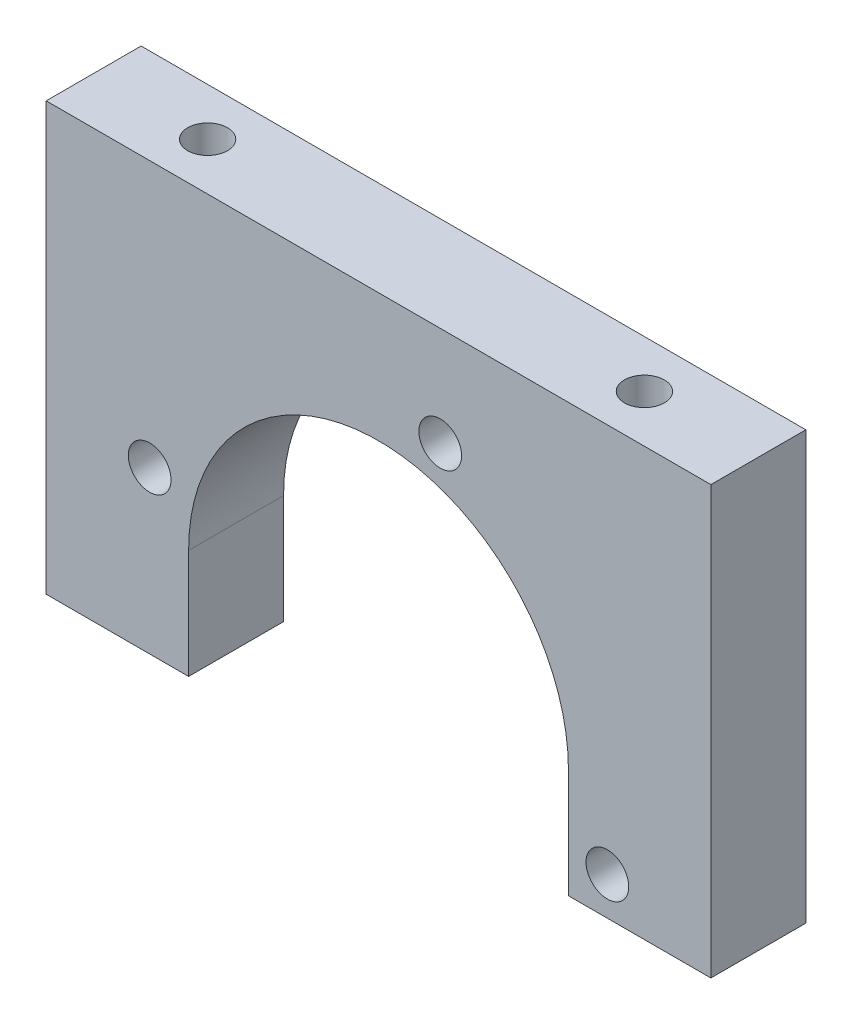
ISO-10303-21;
HEADER;
FILE_DESCRIPTION(('STEP AP214'),'2;1');
FILE_NAME('part.step','',(''),(''),'','','');
FILE_SCHEMA(('AUTOMOTIVE_DESIGN { 1 0 10303 214 1 1 1 1 }'));
ENDSEC;
DATA;
#1=APPLICATION_CONTEXT('core data for automotive mechanical design processes');
#2=APPLICATION_PROTOCOL_DEFINITION('international standard','automotive_design',2000,#1);
#3=PRODUCT_CONTEXT('',#1,'mechanical');
#4=PRODUCT('Part','Part','',(#3));
#5=PRODUCT_RELATED_PRODUCT_CATEGORY('part','',(#4));
#6=PRODUCT_DEFINITION_FORMATION('','',#4);
#7=PRODUCT_DEFINITION_CONTEXT('part definition',#1,'design');
#8=PRODUCT_DEFINITION('design','',#6,#7);
#9=PRODUCT_DEFINITION_SHAPE('','',#8);
#10=(LENGTH_UNIT() NAMED_UNIT(*) SI_UNIT(.MILLI.,.METRE.));
#11=(NAMED_UNIT(*) PLANE_ANGLE_UNIT() SI_UNIT($,.RADIAN.));
#12=(NAMED_UNIT(*) SI_UNIT($,.STERADIAN.) SOLID_ANGLE_UNIT());
#13=UNCERTAINTY_MEASURE_WITH_UNIT(LENGTH_MEASURE(1.E-05),#10,'distance_accuracy_value','');
#14=(GEOMETRIC_REPRESENTATION_CONTEXT(3) GLOBAL_UNCERTAINTY_ASSIGNED_CONTEXT((#13)) GLOBAL_UNIT_ASSIGNED_CONTEXT((#10,
#11,#12)) REPRESENTATION_CONTEXT('',''));
#15=CARTESIAN_POINT('',(0.,0.,0.));
#16=DIRECTION('',(0.,0.,1.));
#17=DIRECTION('',(1.,0.,0.));
#18=AXIS2_PLACEMENT_3D('',#15,#16,#17);
#19=CARTESIAN_POINT('',(-23.,16.5000000000077,5.));
#20=DIRECTION('',(0.,1.,0.));
#21=DIRECTION('',(0.,0.,1.));
#22=AXIS2_PLACEMENT_3D('',#19,#20,#21);
#23=CONICAL_SURFACE('',#22,2.0999999999799,1.02974425868254);
#24=CARTESIAN_POINT('',(-23.,15.2381927001102,5.));
#25=VERTEX_POINT('',#24);
#26=VERTEX_LOOP('',#25);
#27=FACE_BOUND('',#26,.T.);
#28=CARTESIAN_POINT('',(-23.,16.5,5.));
#29=DIRECTION('',(0.,1.,0.));
#30=DIRECTION('',(0.,0.,1.));
#31=AXIS2_PLACEMENT_3D('',#28,#29,#30);
#32=CIRCLE('',#31,2.1);
#33=CARTESIAN_POINT('',(-23.,16.5,7.1));
#34=VERTEX_POINT('',#33);
#35=EDGE_CURVE('E101',#34,#34,#32,.T.);
#36=ORIENTED_EDGE('',*,*,#35,.T.);
#37=EDGE_LOOP('',(#36));
#38=FACE_BOUND('',#37,.T.);
#39=ADVANCED_FACE('F16',(#27,#38),#23,.F.);
#40=CARTESIAN_POINT('',(23.,16.5000000000077,5.));
#41=DIRECTION('',(0.,1.,0.));
#42=DIRECTION('',(0.,0.,1.));
#43=AXIS2_PLACEMENT_3D('',#40,#41,#42);
#44=CONICAL_SURFACE('',#43,2.0999999999799,1.02974425868254);
#45=CARTESIAN_POINT('',(23.,15.2381927001102,5.));
#46=VERTEX_POINT('',#45);
#47=VERTEX_LOOP('',#46);
#48=FACE_BOUND('',#47,.T.);
#49=CARTESIAN_POINT('',(23.,16.5,5.));
#50=DIRECTION('',(0.,1.,0.));
#51=DIRECTION('',(0.,0.,1.));
#52=AXIS2_PLACEMENT_3D('',#49,#50,#51);
#53=CIRCLE('',#52,2.1);
#54=CARTESIAN_POINT('',(23.,16.5,7.1));
#55=VERTEX_POINT('',#54);
#56=EDGE_CURVE('E103',#55,#55,#53,.T.);
#57=ORIENTED_EDGE('',*,*,#56,.T.);
#58=EDGE_LOOP('',(#57));
#59=FACE_BOUND('',#58,.T.);
#60=ADVANCED_FACE('F98',(#48,#59),#44,.F.);
#61=CARTESIAN_POINT('',(-23.,33.5,5.));
#62=DIRECTION('',(0.,1.,0.));
#63=DIRECTION('',(0.,0.,1.));
#64=AXIS2_PLACEMENT_3D('',#61,#62,#63);
#65=CYLINDRICAL_SURFACE('',#64,2.1);
#66=ORIENTED_EDGE('',*,*,#35,.F.);
#67=EDGE_LOOP('',(#66));
#68=FACE_BOUND('',#67,.T.);
#69=CARTESIAN_POINT('',(-23.,33.5,5.));
#70=DIRECTION('',(0.,1.,0.));
#71=DIRECTION('',(0.,0.,1.));
#72=AXIS2_PLACEMENT_3D('',#69,#70,#71);
#73=CIRCLE('',#72,2.1);
#74=CARTESIAN_POINT('',(-23.,33.5,7.1));
#75=VERTEX_POINT('',#74);
#76=EDGE_CURVE('E126',#75,#75,#73,.T.);
#77=ORIENTED_EDGE('',*,*,#76,.T.);
#78=EDGE_LOOP('',(#77));
#79=FACE_BOUND('',#78,.T.);
#80=ADVANCED_FACE('F293',(#68,#79),#65,.F.);
#81=CARTESIAN_POINT('',(23.,33.5,5.));
#82=DIRECTION('',(0.,1.,0.));
#83=DIRECTION('',(0.,0.,1.));
#84=AXIS2_PLACEMENT_3D('',#81,#82,#83);
#85=CYLINDRICAL_SURFACE('',#84,2.1);
#86=ORIENTED_EDGE('',*,*,#56,.F.);
#87=EDGE_LOOP('',(#86));
#88=FACE_BOUND('',#87,.T.);
#89=CARTESIAN_POINT('',(23.,33.5,5.));
#90=DIRECTION('',(0.,1.,0.));
#91=DIRECTION('',(0.,0.,1.));
#92=AXIS2_PLACEMENT_3D('',#89,#90,#91);
#93=CIRCLE('',#92,2.1);
#94=CARTESIAN_POINT('',(23.,33.5,7.1));
#95=VERTEX_POINT('',#94);
#96=EDGE_CURVE('E122',#95,#95,#93,.T.);
#97=ORIENTED_EDGE('',*,*,#96,.T.);
#98=EDGE_LOOP('',(#97));
#99=FACE_BOUND('',#98,.T.);
#100=ADVANCED_FACE('F154',(#88,#99),#85,.F.);
#101=CARTESIAN_POINT('',(-35.,-11.5,0.));
#102=DIRECTION('',(0.,0.,1.));
#103=DIRECTION('',(1.,0.,0.));
#104=AXIS2_PLACEMENT_3D('',#101,#102,#103);
#105=PLANE('',#104);
#106=DIRECTION('',(0.,1.,0.));
#107=VECTOR('',#106,1.);
#108=CARTESIAN_POINT('',(20.,-11.5,0.));
#109=LINE('',#108,#107);
#110=CARTESIAN_POINT('',(20.,-11.5,0.));
#111=VERTEX_POINT('',#110);
#112=CARTESIAN_POINT('',(20.,0.,0.));
#113=VERTEX_POINT('',#112);
#114=EDGE_CURVE('E52',#111,#113,#109,.T.);
#115=ORIENTED_EDGE('',*,*,#114,.T.);
#116=CARTESIAN_POINT('',(0.,0.,0.));
#117=DIRECTION('',(0.,0.,-1.));
#118=DIRECTION('',(-1.,0.,0.));
#119=AXIS2_PLACEMENT_3D('',#116,#117,#118);
#120=CIRCLE('',#119,20.);
#121=CARTESIAN_POINT('',(-20.,0.,0.));
#122=VERTEX_POINT('',#121);
#123=EDGE_CURVE('E119',#113,#122,#120,.F.);
#124=ORIENTED_EDGE('',*,*,#123,.T.);
#125=DIRECTION('',(0.,-1.,0.));
#126=VECTOR('',#125,1.);
#127=CARTESIAN_POINT('',(-20.,-11.5,0.));
#128=LINE('',#127,#126);
#129=CARTESIAN_POINT('',(-20.,-11.5,0.));
#130=VERTEX_POINT('',#129);
#131=EDGE_CURVE('E57',#122,#130,#128,.T.);
#132=ORIENTED_EDGE('',*,*,#131,.T.);
#133=DIRECTION('',(1.,0.,0.));
#134=VECTOR('',#133,1.);
#135=CARTESIAN_POINT('',(-35.,-11.5,0.));
#136=LINE('',#135,#134);
#137=CARTESIAN_POINT('',(-35.,-11.5,0.));
#138=VERTEX_POINT('',#137);
#139=EDGE_CURVE('E64',#130,#138,#136,.F.);
#140=ORIENTED_EDGE('',*,*,#139,.T.);
#141=DIRECTION('',(0.,1.,0.));
#142=VECTOR('',#141,1.);
#143=CARTESIAN_POINT('',(-35.,33.5,0.));
#144=LINE('',#143,#142);
#145=CARTESIAN_POINT('',(-35.,33.5,0.));
#146=VERTEX_POINT('',#145);
#147=EDGE_CURVE('E399',#138,#146,#144,.T.);
#148=ORIENTED_EDGE('',*,*,#147,.T.);
#149=DIRECTION('',(1.,0.,0.));
#150=VECTOR('',#149,1.);
#151=CARTESIAN_POINT('',(-35.,33.5,0.));
#152=LINE('',#151,#150);
#153=CARTESIAN_POINT('',(35.,33.5,0.));
#154=VERTEX_POINT('',#153);
#155=EDGE_CURVE('E409',#146,#154,#152,.T.);
#156=ORIENTED_EDGE('',*,*,#155,.T.);
#157=DIRECTION('',(0.,1.,0.));
#158=VECTOR('',#157,1.);
#159=CARTESIAN_POINT('',(35.,33.5,0.));
#160=LINE('',#159,#158);
#161=CARTESIAN_POINT('',(35.,-11.5,0.));
#162=VERTEX_POINT('',#161);
#163=EDGE_CURVE('E129',#154,#162,#160,.F.);
#164=ORIENTED_EDGE('',*,*,#163,.T.);
#165=DIRECTION('',(1.,0.,0.));
#166=VECTOR('',#165,1.);
#167=CARTESIAN_POINT('',(-35.,-11.5,0.));
#168=LINE('',#167,#166);
#169=EDGE_CURVE('E369',#162,#111,#168,.F.);
#170=ORIENTED_EDGE('',*,*,#169,.T.);
#171=EDGE_LOOP('',(#115,#124,#132,#140,#148,#156,#164,#170));
#172=FACE_BOUND('',#171,.T.);
#173=CARTESIAN_POINT('',(24.1,-7.5,0.));
#174=DIRECTION('',(0.,0.,1.));
#175=DIRECTION('',(1.,0.,0.));
#176=AXIS2_PLACEMENT_3D('',#173,#174,#175);
#177=CIRCLE('',#176,2.25);
#178=CARTESIAN_POINT('',(26.35,-7.5,0.));
#179=VERTEX_POINT('',#178);
#180=EDGE_CURVE('E130',#179,#179,#177,.T.);
#181=ORIENTED_EDGE('',*,*,#180,.T.);
#182=EDGE_LOOP('',(#181));
#183=FACE_BOUND('',#182,.T.);
#184=CARTESIAN_POINT('',(6.5,23.,0.));
#185=DIRECTION('',(0.,0.,1.));
#186=DIRECTION('',(1.,0.,0.));
#187=AXIS2_PLACEMENT_3D('',#184,#185,#186);
#188=CIRCLE('',#187,2.25);
#189=CARTESIAN_POINT('',(8.75,23.,0.));
#190=VERTEX_POINT('',#189);
#191=EDGE_CURVE('E132',#190,#190,#188,.T.);
#192=ORIENTED_EDGE('',*,*,#191,.T.);
#193=EDGE_LOOP('',(#192));
#194=FACE_BOUND('',#193,.T.);
#195=CARTESIAN_POINT('',(-24.1,5.5,0.));
#196=DIRECTION('',(0.,0.,1.));
#197=DIRECTION('',(1.,0.,0.));
#198=AXIS2_PLACEMENT_3D('',#195,#196,#197);
#199=CIRCLE('',#198,2.25);
#200=CARTESIAN_POINT('',(-21.85,5.5,0.));
#201=VERTEX_POINT('',#200);
#202=EDGE_CURVE('E19',#201,#201,#199,.T.);
#203=ORIENTED_EDGE('',*,*,#202,.T.);
#204=EDGE_LOOP('',(#203));
#205=FACE_BOUND('',#204,.T.);
#206=ADVANCED_FACE('F139',(#172,#183,#194,#205),#105,.F.);
#207=CARTESIAN_POINT('',(-24.1,5.5,10.));
#208=DIRECTION('',(0.,0.,1.));
#209=DIRECTION('',(1.,0.,0.));
#210=AXIS2_PLACEMENT_3D('',#207,#208,#209);
#211=CYLINDRICAL_SURFACE('',#210,2.25);
#212=CARTESIAN_POINT('',(-24.1,5.5,10.));
#213=DIRECTION('',(0.,0.,1.));
#214=DIRECTION('',(1.,0.,0.));
#215=AXIS2_PLACEMENT_3D('',#212,#213,#214);
#216=CIRCLE('',#215,2.25);
#217=CARTESIAN_POINT('',(-21.85,5.5,10.));
#218=VERTEX_POINT('',#217);
#219=EDGE_CURVE('E116',#218,#218,#216,.F.);
#220=ORIENTED_EDGE('',*,*,#219,.F.);
#221=EDGE_LOOP('',(#220));
#222=FACE_BOUND('',#221,.T.);
#223=ORIENTED_EDGE('',*,*,#202,.F.);
#224=EDGE_LOOP('',(#223));
#225=FACE_BOUND('',#224,.T.);
#226=ADVANCED_FACE('F141',(#222,#225),#211,.F.);
#227=CARTESIAN_POINT('',(6.5,23.,10.));
#228=DIRECTION('',(0.,0.,1.));
#229=DIRECTION('',(1.,0.,0.));
#230=AXIS2_PLACEMENT_3D('',#227,#228,#229);
#231=CYLINDRICAL_SURFACE('',#230,2.25);
#232=CARTESIAN_POINT('',(6.5,23.,10.));
#233=DIRECTION('',(0.,0.,1.));
#234=DIRECTION('',(1.,0.,0.));
#235=AXIS2_PLACEMENT_3D('',#232,#233,#234);
#236=CIRCLE('',#235,2.25);
#237=CARTESIAN_POINT('',(8.75,23.,10.));
#238=VERTEX_POINT('',#237);
#239=EDGE_CURVE('E113',#238,#238,#236,.F.);
#240=ORIENTED_EDGE('',*,*,#239,.F.);
#241=EDGE_LOOP('',(#240));
#242=FACE_BOUND('',#241,.T.);
#243=ORIENTED_EDGE('',*,*,#191,.F.);
#244=EDGE_LOOP('',(#243));
#245=FACE_BOUND('',#244,.T.);
#246=ADVANCED_FACE('F143',(#242,#245),#231,.F.);
#247=CARTESIAN_POINT('',(24.1,-7.5,10.));
#248=DIRECTION('',(0.,0.,1.));
#249=DIRECTION('',(1.,0.,0.));
#250=AXIS2_PLACEMENT_3D('',#247,#248,#249);
#251=CYLINDRICAL_SURFACE('',#250,2.25);
#252=CARTESIAN_POINT('',(24.1,-7.5,10.));
#253=DIRECTION('',(0.,0.,1.));
#254=DIRECTION('',(1.,0.,0.));
#255=AXIS2_PLACEMENT_3D('',#252,#253,#254);
#256=CIRCLE('',#255,2.25);
#257=CARTESIAN_POINT('',(26.35,-7.5,10.));
#258=VERTEX_POINT('',#257);
#259=EDGE_CURVE('E109',#258,#258,#256,.F.);
#260=ORIENTED_EDGE('',*,*,#259,.F.);
#261=EDGE_LOOP('',(#260));
#262=FACE_BOUND('',#261,.T.);
#263=ORIENTED_EDGE('',*,*,#180,.F.);
#264=EDGE_LOOP('',(#263));
#265=FACE_BOUND('',#264,.T.);
#266=ADVANCED_FACE('F151',(#262,#265),#251,.F.);
#267=CARTESIAN_POINT('',(20.,-11.5,10.));
#268=DIRECTION('',(1.,0.,0.));
#269=DIRECTION('',(0.,1.,0.));
#270=AXIS2_PLACEMENT_3D('',#267,#268,#269);
#271=PLANE('',#270);
#272=DIRECTION('',(0.,0.,1.));
#273=VECTOR('',#272,1.);
#274=CARTESIAN_POINT('',(20.,-11.5,10.));
#275=LINE('',#274,#273);
#276=CARTESIAN_POINT('',(20.,-11.5,10.));
#277=VERTEX_POINT('',#276);
#278=EDGE_CURVE('E364',#111,#277,#275,.T.);
#279=ORIENTED_EDGE('',*,*,#278,.T.);
#280=DIRECTION('',(0.,1.,0.));
#281=VECTOR('',#280,1.);
#282=CARTESIAN_POINT('',(20.,-11.5,10.));
#283=LINE('',#282,#281);
#284=CARTESIAN_POINT('',(20.,0.,10.));
#285=VERTEX_POINT('',#284);
#286=EDGE_CURVE('E112',#285,#277,#283,.F.);
#287=ORIENTED_EDGE('',*,*,#286,.F.);
#288=DIRECTION('',(0.,0.,-1.));
#289=VECTOR('',#288,1.);
#290=CARTESIAN_POINT('',(20.,0.,10.));
#291=LINE('',#290,#289);
#292=EDGE_CURVE('E121',#285,#113,#291,.T.);
#293=ORIENTED_EDGE('',*,*,#292,.T.);
#294=ORIENTED_EDGE('',*,*,#114,.F.);
#295=EDGE_LOOP('',(#279,#287,#293,#294));
#296=FACE_BOUND('',#295,.T.);
#297=ADVANCED_FACE('F191',(#296),#271,.F.);
#298=CARTESIAN_POINT('',(-35.,-11.5,10.));
#299=DIRECTION('',(0.,1.,0.));
#300=DIRECTION('',(0.,0.,1.));
#301=AXIS2_PLACEMENT_3D('',#298,#299,#300);
#302=PLANE('',#301);
#303=ORIENTED_EDGE('',*,*,#278,.F.);
#304=ORIENTED_EDGE('',*,*,#169,.F.);
#305=DIRECTION('',(0.,0.,1.));
#306=VECTOR('',#305,1.);
#307=CARTESIAN_POINT('',(35.,-11.5,10.));
#308=LINE('',#307,#306);
#309=CARTESIAN_POINT('',(35.,-11.5,10.));
#310=VERTEX_POINT('',#309);
#311=EDGE_CURVE('E368',#162,#310,#308,.T.);
#312=ORIENTED_EDGE('',*,*,#311,.T.);
#313=DIRECTION('',(1.,0.,0.));
#314=VECTOR('',#313,1.);
#315=CARTESIAN_POINT('',(-35.,-11.5,10.));
#316=LINE('',#315,#314);
#317=EDGE_CURVE('E372',#277,#310,#316,.T.);
#318=ORIENTED_EDGE('',*,*,#317,.F.);
#319=EDGE_LOOP('',(#303,#304,#312,#318));
#320=FACE_BOUND('',#319,.T.);
#321=ADVANCED_FACE('F187',(#320),#302,.F.);
#322=CARTESIAN_POINT('',(35.,33.5,10.));
#323=DIRECTION('',(-1.,0.,0.));
#324=DIRECTION('',(0.,0.,1.));
#325=AXIS2_PLACEMENT_3D('',#322,#323,#324);
#326=PLANE('',#325);
#327=DIRECTION('',(0.,0.,-1.));
#328=VECTOR('',#327,1.);
#329=CARTESIAN_POINT('',(35.,33.5,10.));
#330=LINE('',#329,#328);
#331=CARTESIAN_POINT('',(35.,33.5,10.));
#332=VERTEX_POINT('',#331);
#333=EDGE_CURVE('E125',#154,#332,#330,.F.);
#334=ORIENTED_EDGE('',*,*,#333,.T.);
#335=DIRECTION('',(0.,1.,0.));
#336=VECTOR('',#335,1.);
#337=CARTESIAN_POINT('',(35.,-11.5,10.));
#338=LINE('',#337,#336);
#339=EDGE_CURVE('E376',#310,#332,#338,.T.);
#340=ORIENTED_EDGE('',*,*,#339,.F.);
#341=ORIENTED_EDGE('',*,*,#311,.F.);
#342=ORIENTED_EDGE('',*,*,#163,.F.);
#343=EDGE_LOOP('',(#334,#340,#341,#342));
#344=FACE_BOUND('',#343,.T.);
#345=ADVANCED_FACE('F183',(#344),#326,.F.);
#346=CARTESIAN_POINT('',(-35.,33.5,10.));
#347=DIRECTION('',(0.,-1.,0.));
#348=DIRECTION('',(0.,0.,-1.));
#349=AXIS2_PLACEMENT_3D('',#346,#347,#348);
#350=PLANE('',#349);
#351=DIRECTION('',(0.,0.,-1.));
#352=VECTOR('',#351,1.);
#353=CARTESIAN_POINT('',(-35.,33.5,10.));
#354=LINE('',#353,#352);
#355=CARTESIAN_POINT('',(-35.,33.5,10.));
#356=VERTEX_POINT('',#355);
#357=EDGE_CURVE('E407',#146,#356,#354,.F.);
#358=ORIENTED_EDGE('',*,*,#357,.T.);
#359=DIRECTION('',(1.,0.,0.));
#360=VECTOR('',#359,1.);
#361=CARTESIAN_POINT('',(-35.,33.5,10.));
#362=LINE('',#361,#360);
#363=EDGE_CURVE('E404',#332,#356,#362,.F.);
#364=ORIENTED_EDGE('',*,*,#363,.F.);
#365=ORIENTED_EDGE('',*,*,#333,.F.);
#366=ORIENTED_EDGE('',*,*,#155,.F.);
#367=EDGE_LOOP('',(#358,#364,#365,#366));
#368=FACE_BOUND('',#367,.T.);
#369=ORIENTED_EDGE('',*,*,#96,.F.);
#370=EDGE_LOOP('',(#369));
#371=FACE_BOUND('',#370,.T.);
#372=ORIENTED_EDGE('',*,*,#76,.F.);
#373=EDGE_LOOP('',(#372));
#374=FACE_BOUND('',#373,.T.);
#375=ADVANCED_FACE('F179',(#368,#371,#374),#350,.F.);
#376=CARTESIAN_POINT('',(-35.,33.5,10.));
#377=DIRECTION('',(1.,0.,0.));
#378=DIRECTION('',(0.,0.,-1.));
#379=AXIS2_PLACEMENT_3D('',#376,#377,#378);
#380=PLANE('',#379);
#381=DIRECTION('',(0.,0.,1.));
#382=VECTOR('',#381,1.);
#383=CARTESIAN_POINT('',(-35.,-11.5,10.));
#384=LINE('',#383,#382);
#385=CARTESIAN_POINT('',(-35.,-11.5,10.));
#386=VERTEX_POINT('',#385);
#387=EDGE_CURVE('E397',#138,#386,#384,.T.);
#388=ORIENTED_EDGE('',*,*,#387,.T.);
#389=DIRECTION('',(0.,1.,0.));
#390=VECTOR('',#389,1.);
#391=CARTESIAN_POINT('',(-35.,-11.5,10.));
#392=LINE('',#391,#390);
#393=EDGE_CURVE('E394',#356,#386,#392,.F.);
#394=ORIENTED_EDGE('',*,*,#393,.F.);
#395=ORIENTED_EDGE('',*,*,#357,.F.);
#396=ORIENTED_EDGE('',*,*,#147,.F.);
#397=EDGE_LOOP('',(#388,#394,#395,#396));
#398=FACE_BOUND('',#397,.T.);
#399=ADVANCED_FACE('F176',(#398),#380,.F.);
#400=CARTESIAN_POINT('',(-35.,-11.5,10.));
#401=DIRECTION('',(0.,1.,0.));
#402=DIRECTION('',(0.,0.,1.));
#403=AXIS2_PLACEMENT_3D('',#400,#401,#402);
#404=PLANE('',#403);
#405=DIRECTION('',(0.,0.,1.));
#406=VECTOR('',#405,1.);
#407=CARTESIAN_POINT('',(-20.,-11.5,10.));
#408=LINE('',#407,#406);
#409=CARTESIAN_POINT('',(-20.,-11.5,10.));
#410=VERTEX_POINT('',#409);
#411=EDGE_CURVE('E387',#130,#410,#408,.T.);
#412=ORIENTED_EDGE('',*,*,#411,.T.);
#413=DIRECTION('',(1.,0.,0.));
#414=VECTOR('',#413,1.);
#415=CARTESIAN_POINT('',(-35.,-11.5,10.));
#416=LINE('',#415,#414);
#417=EDGE_CURVE('E391',#386,#410,#416,.T.);
#418=ORIENTED_EDGE('',*,*,#417,.F.);
#419=ORIENTED_EDGE('',*,*,#387,.F.);
#420=ORIENTED_EDGE('',*,*,#139,.F.);
#421=EDGE_LOOP('',(#412,#418,#419,#420));
#422=FACE_BOUND('',#421,.T.);
#423=ADVANCED_FACE('F173',(#422),#404,.F.);
#424=CARTESIAN_POINT('',(-20.,-11.5,10.));
#425=DIRECTION('',(-1.,0.,0.));
#426=DIRECTION('',(0.,-1.,0.));
#427=AXIS2_PLACEMENT_3D('',#424,#425,#426);
#428=PLANE('',#427);
#429=DIRECTION('',(0.,0.,-1.));
#430=VECTOR('',#429,1.);
#431=CARTESIAN_POINT('',(-20.,0.,10.));
#432=LINE('',#431,#430);
#433=CARTESIAN_POINT('',(-20.,0.,10.));
#434=VERTEX_POINT('',#433);
#435=EDGE_CURVE('E34',#122,#434,#432,.F.);
#436=ORIENTED_EDGE('',*,*,#435,.T.);
#437=DIRECTION('',(0.,1.,0.));
#438=VECTOR('',#437,1.);
#439=CARTESIAN_POINT('',(-20.,-11.5,10.));
#440=LINE('',#439,#438);
#441=EDGE_CURVE('E25',#410,#434,#440,.T.);
#442=ORIENTED_EDGE('',*,*,#441,.F.);
#443=ORIENTED_EDGE('',*,*,#411,.F.);
#444=ORIENTED_EDGE('',*,*,#131,.F.);
#445=EDGE_LOOP('',(#436,#442,#443,#444));
#446=FACE_BOUND('',#445,.T.);
#447=ADVANCED_FACE('F165',(#446),#428,.F.);
#448=CARTESIAN_POINT('',(0.,0.,10.));
#449=DIRECTION('',(0.,0.,-1.));
#450=DIRECTION('',(-1.,0.,0.));
#451=AXIS2_PLACEMENT_3D('',#448,#449,#450);
#452=CYLINDRICAL_SURFACE('',#451,20.);
#453=ORIENTED_EDGE('',*,*,#292,.F.);
#454=CARTESIAN_POINT('',(0.,0.,10.));
#455=DIRECTION('',(0.,0.,-1.));
#456=DIRECTION('',(-1.,0.,0.));
#457=AXIS2_PLACEMENT_3D('',#454,#455,#456);
#458=CIRCLE('',#457,20.);
#459=EDGE_CURVE('E11',#434,#285,#458,.T.);
#460=ORIENTED_EDGE('',*,*,#459,.F.);
#461=ORIENTED_EDGE('',*,*,#435,.F.);
#462=ORIENTED_EDGE('',*,*,#123,.F.);
#463=EDGE_LOOP('',(#453,#460,#461,#462));
#464=FACE_BOUND('',#463,.T.);
#465=ADVANCED_FACE('F159',(#464),#452,.F.);
#466=CARTESIAN_POINT('',(-35.,-11.5,10.));
#467=DIRECTION('',(0.,0.,1.));
#468=DIRECTION('',(1.,0.,0.));
#469=AXIS2_PLACEMENT_3D('',#466,#467,#468);
#470=PLANE('',#469);
#471=ORIENTED_EDGE('',*,*,#441,.T.);
#472=ORIENTED_EDGE('',*,*,#459,.T.);
#473=ORIENTED_EDGE('',*,*,#286,.T.);
#474=ORIENTED_EDGE('',*,*,#317,.T.);
#475=ORIENTED_EDGE('',*,*,#339,.T.);
#476=ORIENTED_EDGE('',*,*,#363,.T.);
#477=ORIENTED_EDGE('',*,*,#393,.T.);
#478=ORIENTED_EDGE('',*,*,#417,.T.);
#479=EDGE_LOOP('',(#471,#472,#473,#474,#475,#476,#477,#478));
#480=FACE_BOUND('',#479,.T.);
#481=ORIENTED_EDGE('',*,*,#259,.T.);
#482=EDGE_LOOP('',(#481));
#483=FACE_BOUND('',#482,.T.);
#484=ORIENTED_EDGE('',*,*,#239,.T.);
#485=EDGE_LOOP('',(#484));
#486=FACE_BOUND('',#485,.T.);
#487=ORIENTED_EDGE('',*,*,#219,.T.);
#488=EDGE_LOOP('',(#487));
#489=FACE_BOUND('',#488,.T.);
#490=ADVANCED_FACE('F157',(#480,#483,#486,#489),#470,.T.);
#491=CLOSED_SHELL('',(#39,#60,#80,#100,#206,#226,#246,#266,#297,#321,#345,#375,#399,#423,#447,
#465,#490));
#492=MANIFOLD_SOLID_BREP('B1',#491);
#493=ADVANCED_BREP_SHAPE_REPRESENTATION('',(#18,#492),#14);
#494=SHAPE_DEFINITION_REPRESENTATION(#9,#493);
ENDSEC;
END-ISO-10303-21;
